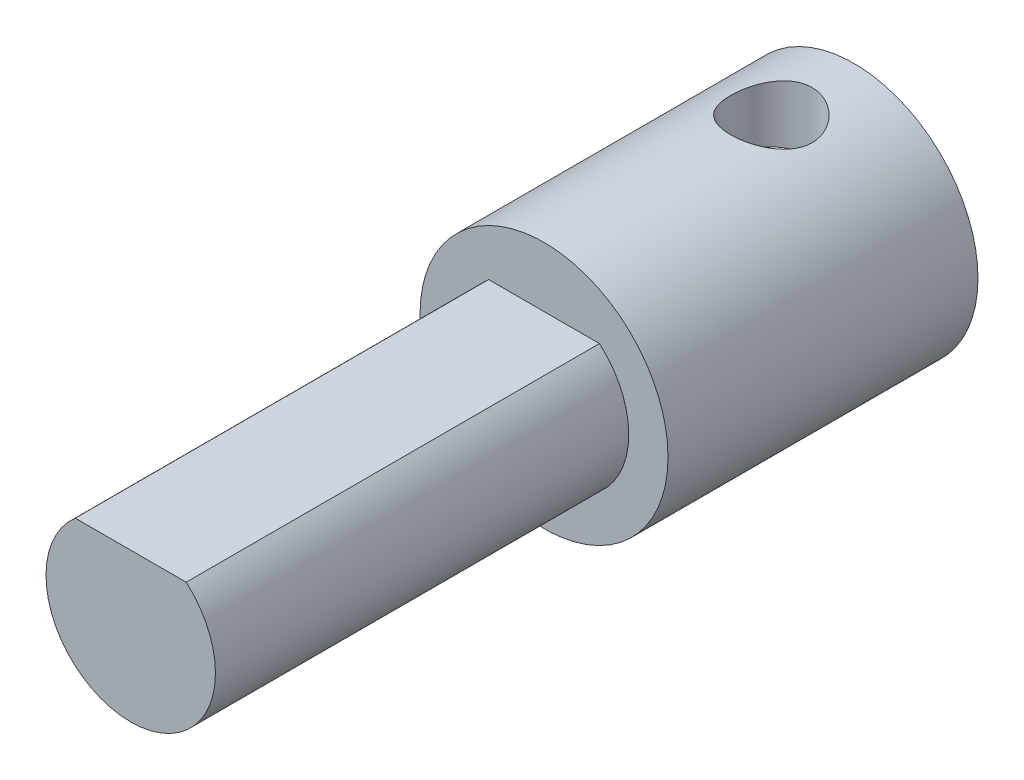
ISO-10303-21;
HEADER;
FILE_DESCRIPTION(('STEP AP214'),'2;1');
FILE_NAME('part.step','',(''),(''),'','','');
FILE_SCHEMA(('AUTOMOTIVE_DESIGN { 1 0 10303 214 1 1 1 1 }'));
ENDSEC;
DATA;
#1=APPLICATION_CONTEXT('core data for automotive mechanical design processes');
#2=APPLICATION_PROTOCOL_DEFINITION('international standard','automotive_design',2000,#1);
#3=PRODUCT_CONTEXT('',#1,'mechanical');
#4=PRODUCT('Part','Part','',(#3));
#5=PRODUCT_RELATED_PRODUCT_CATEGORY('part','',(#4));
#6=PRODUCT_DEFINITION_FORMATION('','',#4);
#7=PRODUCT_DEFINITION_CONTEXT('part definition',#1,'design');
#8=PRODUCT_DEFINITION('design','',#6,#7);
#9=PRODUCT_DEFINITION_SHAPE('','',#8);
#10=(LENGTH_UNIT() NAMED_UNIT(*) SI_UNIT(.MILLI.,.METRE.));
#11=(NAMED_UNIT(*) PLANE_ANGLE_UNIT() SI_UNIT($,.RADIAN.));
#12=(NAMED_UNIT(*) SI_UNIT($,.STERADIAN.) SOLID_ANGLE_UNIT());
#13=UNCERTAINTY_MEASURE_WITH_UNIT(LENGTH_MEASURE(1.E-05),#10,'distance_accuracy_value','');
#14=(GEOMETRIC_REPRESENTATION_CONTEXT(3) GLOBAL_UNCERTAINTY_ASSIGNED_CONTEXT((#13)) GLOBAL_UNIT_ASSIGNED_CONTEXT((#10,
#11,#12)) REPRESENTATION_CONTEXT('',''));
#15=CARTESIAN_POINT('',(0.,0.,0.));
#16=DIRECTION('',(0.,0.,1.));
#17=DIRECTION('',(1.,0.,0.));
#18=AXIS2_PLACEMENT_3D('',#15,#16,#17);
#19=CARTESIAN_POINT('',(0.,0.,15.));
#20=DIRECTION('',(0.,0.,-1.));
#21=DIRECTION('',(-1.,0.,0.));
#22=AXIS2_PLACEMENT_3D('',#19,#20,#21);
#23=CYLINDRICAL_SURFACE('',#22,6.);
#24=CARTESIAN_POINT('',(0.,0.,15.));
#25=DIRECTION('',(0.,0.,1.));
#26=DIRECTION('',(1.,0.,0.));
#27=AXIS2_PLACEMENT_3D('',#24,#25,#26);
#28=CIRCLE('',#27,6.);
#29=CARTESIAN_POINT('',(6.,0.,15.));
#30=VERTEX_POINT('',#29);
#31=EDGE_CURVE('E129',#30,#30,#28,.T.);
#32=ORIENTED_EDGE('',*,*,#31,.F.);
#33=EDGE_LOOP('',(#32));
#34=FACE_BOUND('',#33,.T.);
#35=CARTESIAN_POINT('',(0.,0.,0.));
#36=DIRECTION('',(0.,0.,1.));
#37=DIRECTION('',(1.,0.,0.));
#38=AXIS2_PLACEMENT_3D('',#35,#36,#37);
#39=CIRCLE('',#38,6.);
#40=CARTESIAN_POINT('',(6.,0.,0.));
#41=VERTEX_POINT('',#40);
#42=EDGE_CURVE('E126',#41,#41,#39,.T.);
#43=ORIENTED_EDGE('',*,*,#42,.T.);
#44=EDGE_LOOP('',(#43));
#45=FACE_BOUND('',#44,.T.);
#46=CARTESIAN_POINT('',(0.,6.,2.025));
#47=CARTESIAN_POINT('',(0.107838543029105,6.00000011352229,2.02499976131817));
#48=CARTESIAN_POINT('',(0.21567620710098,5.9970657738863,2.03386107836114));
#49=CARTESIAN_POINT('',(0.428179805737479,5.98564883665976,2.06896694241115));
#50=CARTESIAN_POINT('',(0.532845330853448,5.97716552599178,2.09521372356435));
#51=CARTESIAN_POINT('',(0.735910232741169,5.95557344345634,2.16409658901036));
#52=CARTESIAN_POINT('',(0.834319618034925,5.94247229080572,2.20670568656743));
#53=CARTESIAN_POINT('',(1.02259569560956,5.91298491352273,2.30698315113832));
#54=CARTESIAN_POINT('',(1.11246076477889,5.8965980665578,2.36465437164631));
#55=CARTESIAN_POINT('',(1.28414136348541,5.86164608890044,2.49547162312368));
#56=CARTESIAN_POINT('',(1.3656273576988,5.84302972721422,2.56903636467845));
#57=CARTESIAN_POINT('',(1.51535607545968,5.80600175454958,2.72866193873572));
#58=CARTESIAN_POINT('',(1.58359597867741,5.78759018796065,2.81472542564045));
#59=CARTESIAN_POINT('',(1.70675709516412,5.7524956177278,2.99984881938666));
#60=CARTESIAN_POINT('',(1.76125336467574,5.73587521034265,3.09920444544874));
#61=CARTESIAN_POINT('',(1.85262309086739,5.70702201776774,3.30630599053302));
#62=CARTESIAN_POINT('',(1.8895017731183,5.69478793181556,3.41404941060212));
#63=CARTESIAN_POINT('',(1.94335944770911,5.6766312944446,3.63112651344774));
#64=CARTESIAN_POINT('',(1.96095468211002,5.67051387569388,3.74029052782936));
#65=CARTESIAN_POINT('',(1.97767221167683,5.66470637744098,3.96017951337834));
#66=CARTESIAN_POINT('',(1.97680004803712,5.66501436997576,4.07090400635493));
#67=CARTESIAN_POINT('',(1.95708672736535,5.67185187094256,4.28554808963881));
#68=CARTESIAN_POINT('',(1.93904543823228,5.67810442428375,4.38955148519001));
#69=CARTESIAN_POINT('',(1.88680921363148,5.69567402478234,4.59296374811001));
#70=CARTESIAN_POINT('',(1.85261238899917,5.70699166422276,4.69237207665693));
#71=CARTESIAN_POINT('',(1.76850387116484,5.73361658695736,4.8856076022458));
#72=CARTESIAN_POINT('',(1.71835230408843,5.74898411004008,4.97932173205959));
#73=CARTESIAN_POINT('',(1.6039244493058,5.78195154889167,5.15725898899786));
#74=CARTESIAN_POINT('',(1.53964416369328,5.7995520959268,5.24147941953038));
#75=CARTESIAN_POINT('',(1.3949249155163,5.83609643912531,5.40253888586056));
#76=CARTESIAN_POINT('',(1.31383070658762,5.85506303918087,5.47878515732289));
#77=CARTESIAN_POINT('',(1.13977289424548,5.89141853482326,5.61674862056797));
#78=CARTESIAN_POINT('',(1.04680820956327,5.90880728643844,5.67846448733372));
#79=CARTESIAN_POINT('',(0.850414736743062,5.94026633585184,5.78607676638967));
#80=CARTESIAN_POINT('',(0.746895244920132,5.95430367117555,5.83181793953231));
#81=CARTESIAN_POINT('',(0.533058974791617,5.97723928071201,5.90505471048491));
#82=CARTESIAN_POINT('',(0.422744510343369,5.98613929372089,5.93255648213665));
#83=CARTESIAN_POINT('',(0.203470620923442,5.9975111061203,5.96749191720827));
#84=CARTESIAN_POINT('',(0.0946519858791259,6.00023940824732,5.97572685979307));
#85=CARTESIAN_POINT('',(-0.122831679034045,5.99972750449495,5.97417262073714));
#86=CARTESIAN_POINT('',(-0.23149673117709,5.99648827786976,5.96438639631791));
#87=CARTESIAN_POINT('',(-0.442405445599797,5.98457445192065,5.92770363500026));
#88=CARTESIAN_POINT('',(-0.544743749790424,5.97605521369228,5.90129584335661));
#89=CARTESIAN_POINT('',(-0.743498780123999,5.95459569846244,5.83272761468912));
#90=CARTESIAN_POINT('',(-0.839914753203665,5.94165486059285,5.79056517916719));
#91=CARTESIAN_POINT('',(-1.02687439510982,5.91225185983688,5.69046997399288));
#92=CARTESIAN_POINT('',(-1.11720090205528,5.89570707257473,5.63215654527092));
#93=CARTESIAN_POINT('',(-1.28704881858884,5.86097542245245,5.50186376174146));
#94=CARTESIAN_POINT('',(-1.36656698941293,5.84278807009615,5.42988032607974));
#95=CARTESIAN_POINT('',(-1.51620071646764,5.80580249455741,5.27052194932015));
#96=CARTESIAN_POINT('',(-1.58574457173851,5.78701284828705,5.18260691854629));
#97=CARTESIAN_POINT('',(-1.70915898534431,5.75177437352849,4.99595006935028));
#98=CARTESIAN_POINT('',(-1.76302950097449,5.73532555141833,4.89720822142959));
#99=CARTESIAN_POINT('',(-1.85329830549306,5.70679720360838,4.6917138344355));
#100=CARTESIAN_POINT('',(-1.88973941689085,5.69470698740297,4.58498168159919));
#101=CARTESIAN_POINT('',(-1.94397389560411,5.67642498014278,4.36640795886482));
#102=CARTESIAN_POINT('',(-1.96177538930423,5.67023061875713,4.25456863777116));
#103=CARTESIAN_POINT('',(-1.97760145392028,5.66472904966008,4.03498554418457));
#104=CARTESIAN_POINT('',(-1.97657261248971,5.66509218821798,3.92731747875001));
#105=CARTESIAN_POINT('',(-1.95708775150974,5.67185255633193,3.71377286567212));
#106=CARTESIAN_POINT('',(-1.93863272071954,5.67824944353402,3.60789621673104));
#107=CARTESIAN_POINT('',(-1.88548221896432,5.69611408432527,3.4028371805632));
#108=CARTESIAN_POINT('',(-1.85108595901044,5.70748820634968,3.30356844687465));
#109=CARTESIAN_POINT('',(-1.76727027475222,5.73399326104081,3.11213417947518));
#110=CARTESIAN_POINT('',(-1.71784756916842,5.74912501411767,3.01997020272429));
#111=CARTESIAN_POINT('',(-1.60291632125665,5.78224665502096,2.84109385622663));
#112=CARTESIAN_POINT('',(-1.53681062889341,5.80033104797547,2.7547827573788));
#113=CARTESIAN_POINT('',(-1.39140780214347,5.83691677166686,2.59417276490036));
#114=CARTESIAN_POINT('',(-1.31210698045154,5.85541821769398,2.51987724043094));
#115=CARTESIAN_POINT('',(-1.13897863097521,5.89158944458883,2.38259218993922));
#116=CARTESIAN_POINT('',(-1.04471662360987,5.90920169750159,2.32013357092036));
#117=CARTESIAN_POINT('',(-0.846457164123127,5.94083888130383,2.21201958851786));
#118=CARTESIAN_POINT('',(-0.742462492745509,5.95486483259611,2.16635944387355));
#119=CARTESIAN_POINT('',(-0.533351466736719,5.97712291050407,2.09534754249882));
#120=CARTESIAN_POINT('',(-0.42858497487326,5.98562210439228,2.06904987878124));
#121=CARTESIAN_POINT('',(-0.21587814050949,5.99705987001902,2.03387849030989));
#122=CARTESIAN_POINT('',(-0.107938629959975,5.99999988637235,2.02500023890336));
#123=CARTESIAN_POINT('',(0.,6.,2.025));
#124=B_SPLINE_CURVE_WITH_KNOTS('',3,(#46,#47,#48,#49,#50,#51,#52,#53,#54,#55,#56,#57,#58,#59,
#60,#61,#62,#63,#64,#65,#66,#67,#68,#69,#70,#71,#72,#73,#74,#75,#76,#77,#78,#79,#80,#81,#82,#83,
#84,#85,#86,#87,#88,#89,#90,#91,#92,#93,#94,#95,#96,#97,#98,#99,#100,#101,#102,#103,#104,#105,
#106,#107,#108,#109,#110,#111,#112,#113,#114,#115,#116,#117,#118,#119,#120,#121,#122,#123),
.UNSPECIFIED.,.T.,.F.,(4,2,2,2,2,2,2,2,2,2,2,2,2,2,2,2,2,2,2,2,2,2,2,2,2,2,2,2,2,2,2,2,2,2,2,2,
2,2,4),(0.,0.323118515965139,0.646278562836573,0.968907888048667,1.29159837924266,
1.62414112041347,1.9567545884052,2.29865251030057,2.64044895843541,2.97097173655695,
3.3013953418009,3.61714218388367,3.93292595729892,4.25370161415871,4.57456815582014,
4.91174371284044,5.24895000475546,5.58934753974213,5.9296297949271,6.2554872872591,
6.58129131208194,6.89793621888684,7.21462130617415,7.53951996926852,7.86451577600469,
8.20389133681188,8.54326782229836,8.88180615106307,9.2201968244598,9.54162574189873,
9.86303642260817,10.1786445308543,10.4943216070468,10.8234886510657,11.1527478339349,
11.4944020778095,11.8359590030795,12.1594614885878,12.4828798967776),.UNSPECIFIED.);
#125=CARTESIAN_POINT('',(0.,6.,2.025));
#126=VERTEX_POINT('',#125);
#127=EDGE_CURVE('E113',#126,#126,#124,.T.);
#128=ORIENTED_EDGE('',*,*,#127,.T.);
#129=EDGE_LOOP('',(#128));
#130=FACE_BOUND('',#129,.T.);
#131=ADVANCED_FACE('F46',(#34,#45,#130),#23,.T.);
#132=CARTESIAN_POINT('',(0.,0.,15.));
#133=DIRECTION('',(0.,0.,-1.));
#134=DIRECTION('',(-1.,0.,0.));
#135=AXIS2_PLACEMENT_3D('',#132,#133,#134);
#136=CYLINDRICAL_SURFACE('',#135,4.1);
#137=DIRECTION('',(0.,0.,-1.));
#138=VECTOR('',#137,1.);
#139=CARTESIAN_POINT('',(-2.68328157299975,3.1,15.));
#140=LINE('',#139,#138);
#141=CARTESIAN_POINT('',(-2.68328157299975,3.1,10.));
#142=VERTEX_POINT('',#141);
#143=CARTESIAN_POINT('',(-2.68328157299975,3.1,0.));
#144=VERTEX_POINT('',#143);
#145=EDGE_CURVE('E11',#142,#144,#140,.T.);
#146=ORIENTED_EDGE('',*,*,#145,.F.);
#147=CARTESIAN_POINT('',(0.,0.,10.));
#148=DIRECTION('',(0.,0.,1.));
#149=DIRECTION('',(1.,0.,0.));
#150=AXIS2_PLACEMENT_3D('',#147,#148,#149);
#151=CIRCLE('',#150,4.1);
#152=CARTESIAN_POINT('',(2.68328157299974,3.1,10.));
#153=VERTEX_POINT('',#152);
#154=EDGE_CURVE('E105',#142,#153,#151,.T.);
#155=ORIENTED_EDGE('',*,*,#154,.T.);
#156=DIRECTION('',(0.,0.,-1.));
#157=VECTOR('',#156,1.);
#158=CARTESIAN_POINT('',(2.68328157299975,3.1,15.));
#159=LINE('',#158,#157);
#160=CARTESIAN_POINT('',(2.68328157299975,3.1,0.));
#161=VERTEX_POINT('',#160);
#162=EDGE_CURVE('E55',#153,#161,#159,.T.);
#163=ORIENTED_EDGE('',*,*,#162,.T.);
#164=CARTESIAN_POINT('',(0.,0.,0.));
#165=DIRECTION('',(0.,0.,1.));
#166=DIRECTION('',(1.,0.,0.));
#167=AXIS2_PLACEMENT_3D('',#164,#165,#166);
#168=CIRCLE('',#167,4.1);
#169=EDGE_CURVE('E122',#144,#161,#168,.T.);
#170=ORIENTED_EDGE('',*,*,#169,.F.);
#171=EDGE_LOOP('',(#146,#155,#163,#170));
#172=FACE_BOUND('',#171,.T.);
#173=ADVANCED_FACE('F48',(#172),#136,.F.);
#174=CARTESIAN_POINT('',(0.,3.1,15.));
#175=DIRECTION('',(0.,1.,0.));
#176=DIRECTION('',(0.,0.,1.));
#177=AXIS2_PLACEMENT_3D('',#174,#175,#176);
#178=PLANE('',#177);
#179=CARTESIAN_POINT('',(0.,3.1,4.));
#180=DIRECTION('',(0.,1.,0.));
#181=DIRECTION('',(0.,0.,1.));
#182=AXIS2_PLACEMENT_3D('',#179,#180,#181);
#183=CIRCLE('',#182,1.975);
#184=CARTESIAN_POINT('',(0.,3.1,5.975));
#185=VERTEX_POINT('',#184);
#186=EDGE_CURVE('E109',#185,#185,#183,.T.);
#187=ORIENTED_EDGE('',*,*,#186,.T.);
#188=EDGE_LOOP('',(#187));
#189=FACE_BOUND('',#188,.T.);
#190=DIRECTION('',(-1.,0.,0.));
#191=VECTOR('',#190,1.);
#192=CARTESIAN_POINT('',(0.,3.1,10.));
#193=LINE('',#192,#191);
#194=EDGE_CURVE('E61',#153,#142,#193,.T.);
#195=ORIENTED_EDGE('',*,*,#194,.T.);
#196=ORIENTED_EDGE('',*,*,#145,.T.);
#197=DIRECTION('',(1.,0.,0.));
#198=VECTOR('',#197,1.);
#199=CARTESIAN_POINT('',(0.,3.1,0.));
#200=LINE('',#199,#198);
#201=EDGE_CURVE('E136',#144,#161,#200,.T.);
#202=ORIENTED_EDGE('',*,*,#201,.T.);
#203=ORIENTED_EDGE('',*,*,#162,.F.);
#204=EDGE_LOOP('',(#195,#196,#202,#203));
#205=FACE_BOUND('',#204,.T.);
#206=ADVANCED_FACE('F145',(#189,#205),#178,.F.);
#207=CARTESIAN_POINT('',(0.,0.,15.));
#208=DIRECTION('',(0.,0.,1.));
#209=DIRECTION('',(1.,0.,0.));
#210=AXIS2_PLACEMENT_3D('',#207,#208,#209);
#211=PLANE('',#210);
#212=CARTESIAN_POINT('',(0.,0.,15.));
#213=DIRECTION('',(0.,0.,1.));
#214=DIRECTION('',(1.,0.,0.));
#215=AXIS2_PLACEMENT_3D('',#212,#213,#214);
#216=CIRCLE('',#215,4.1);
#217=CARTESIAN_POINT('',(-2.68328157299975,3.1,15.));
#218=VERTEX_POINT('',#217);
#219=CARTESIAN_POINT('',(2.68328157299975,3.1,15.));
#220=VERTEX_POINT('',#219);
#221=EDGE_CURVE('E96',#218,#220,#216,.T.);
#222=ORIENTED_EDGE('',*,*,#221,.F.);
#223=DIRECTION('',(1.,0.,0.));
#224=VECTOR('',#223,1.);
#225=CARTESIAN_POINT('',(0.,3.1,15.));
#226=LINE('',#225,#224);
#227=EDGE_CURVE('E83',#218,#220,#226,.T.);
#228=ORIENTED_EDGE('',*,*,#227,.T.);
#229=EDGE_LOOP('',(#222,#228));
#230=FACE_BOUND('',#229,.T.);
#231=ORIENTED_EDGE('',*,*,#31,.T.);
#232=EDGE_LOOP('',(#231));
#233=FACE_BOUND('',#232,.T.);
#234=ADVANCED_FACE('F150',(#230,#233),#211,.T.);
#235=CARTESIAN_POINT('',(0.,0.,0.));
#236=DIRECTION('',(0.,0.,1.));
#237=DIRECTION('',(1.,0.,0.));
#238=AXIS2_PLACEMENT_3D('',#235,#236,#237);
#239=PLANE('',#238);
#240=ORIENTED_EDGE('',*,*,#169,.T.);
#241=ORIENTED_EDGE('',*,*,#201,.F.);
#242=EDGE_LOOP('',(#240,#241));
#243=FACE_BOUND('',#242,.T.);
#244=ORIENTED_EDGE('',*,*,#42,.F.);
#245=EDGE_LOOP('',(#244));
#246=FACE_BOUND('',#245,.T.);
#247=ADVANCED_FACE('F147',(#243,#246),#239,.F.);
#248=CARTESIAN_POINT('',(0.,0.,35.));
#249=DIRECTION('',(0.,0.,1.));
#250=DIRECTION('',(1.,0.,0.));
#251=AXIS2_PLACEMENT_3D('',#248,#249,#250);
#252=PLANE('',#251);
#253=CARTESIAN_POINT('',(0.,0.,35.));
#254=DIRECTION('',(0.,0.,1.));
#255=DIRECTION('',(1.,0.,0.));
#256=AXIS2_PLACEMENT_3D('',#253,#254,#255);
#257=CIRCLE('',#256,4.1);
#258=CARTESIAN_POINT('',(-2.68328157299975,3.1,35.));
#259=VERTEX_POINT('',#258);
#260=CARTESIAN_POINT('',(2.68328157299974,3.1,35.));
#261=VERTEX_POINT('',#260);
#262=EDGE_CURVE('E94',#259,#261,#257,.T.);
#263=ORIENTED_EDGE('',*,*,#262,.T.);
#264=DIRECTION('',(-1.,0.,0.));
#265=VECTOR('',#264,1.);
#266=CARTESIAN_POINT('',(0.,3.1,35.));
#267=LINE('',#266,#265);
#268=EDGE_CURVE('E101',#261,#259,#267,.T.);
#269=ORIENTED_EDGE('',*,*,#268,.T.);
#270=EDGE_LOOP('',(#263,#269));
#271=FACE_BOUND('',#270,.T.);
#272=ADVANCED_FACE('F107',(#271),#252,.T.);
#273=CARTESIAN_POINT('',(0.,3.1,10.));
#274=DIRECTION('',(0.,1.,0.));
#275=DIRECTION('',(0.,0.,1.));
#276=AXIS2_PLACEMENT_3D('',#273,#274,#275);
#277=PLANE('',#276);
#278=DIRECTION('',(0.,0.,1.));
#279=VECTOR('',#278,1.);
#280=CARTESIAN_POINT('',(2.68328157299974,3.1,10.));
#281=LINE('',#280,#279);
#282=EDGE_CURVE('E70',#220,#261,#281,.T.);
#283=ORIENTED_EDGE('',*,*,#282,.F.);
#284=ORIENTED_EDGE('',*,*,#227,.F.);
#285=DIRECTION('',(0.,0.,1.));
#286=VECTOR('',#285,1.);
#287=CARTESIAN_POINT('',(-2.68328157299975,3.1,10.));
#288=LINE('',#287,#286);
#289=EDGE_CURVE('E98',#218,#259,#288,.T.);
#290=ORIENTED_EDGE('',*,*,#289,.T.);
#291=ORIENTED_EDGE('',*,*,#268,.F.);
#292=EDGE_LOOP('',(#283,#284,#290,#291));
#293=FACE_BOUND('',#292,.T.);
#294=ADVANCED_FACE('F102',(#293),#277,.T.);
#295=CARTESIAN_POINT('',(0.,0.,10.));
#296=DIRECTION('',(0.,0.,1.));
#297=DIRECTION('',(1.,0.,0.));
#298=AXIS2_PLACEMENT_3D('',#295,#296,#297);
#299=CYLINDRICAL_SURFACE('',#298,4.1);
#300=ORIENTED_EDGE('',*,*,#289,.F.);
#301=ORIENTED_EDGE('',*,*,#221,.T.);
#302=ORIENTED_EDGE('',*,*,#282,.T.);
#303=ORIENTED_EDGE('',*,*,#262,.F.);
#304=EDGE_LOOP('',(#300,#301,#302,#303));
#305=FACE_BOUND('',#304,.T.);
#306=ADVANCED_FACE('F92',(#305),#299,.T.);
#307=CARTESIAN_POINT('',(0.,0.,10.));
#308=DIRECTION('',(0.,0.,1.));
#309=DIRECTION('',(1.,0.,0.));
#310=AXIS2_PLACEMENT_3D('',#307,#308,#309);
#311=PLANE('',#310);
#312=ORIENTED_EDGE('',*,*,#154,.F.);
#313=ORIENTED_EDGE('',*,*,#194,.F.);
#314=EDGE_LOOP('',(#312,#313));
#315=FACE_BOUND('',#314,.T.);
#316=ADVANCED_FACE('F172',(#315),#311,.F.);
#317=CARTESIAN_POINT('',(0.,6.001,4.));
#318=DIRECTION('',(0.,-1.,0.));
#319=DIRECTION('',(0.,0.,-1.));
#320=AXIS2_PLACEMENT_3D('',#317,#318,#319);
#321=CYLINDRICAL_SURFACE('',#320,1.975);
#322=ORIENTED_EDGE('',*,*,#127,.F.);
#323=EDGE_LOOP('',(#322));
#324=FACE_BOUND('',#323,.T.);
#325=ORIENTED_EDGE('',*,*,#186,.F.);
#326=EDGE_LOOP('',(#325));
#327=FACE_BOUND('',#326,.T.);
#328=ADVANCED_FACE('F167',(#324,#327),#321,.F.);
#329=CLOSED_SHELL('',(#131,#173,#206,#234,#247,#272,#294,#306,#316,#328));
#330=MANIFOLD_SOLID_BREP('B2',#329);
#331=ADVANCED_BREP_SHAPE_REPRESENTATION('',(#18,#330),#14);
#332=SHAPE_DEFINITION_REPRESENTATION(#9,#331);
ENDSEC;
END-ISO-10303-21;
